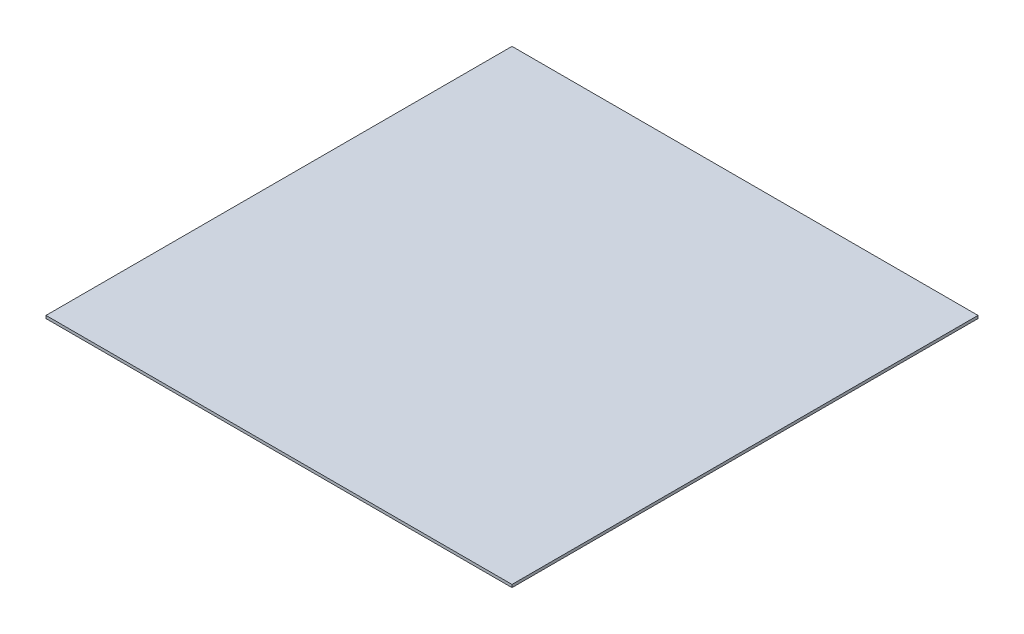
ISO-10303-21;
HEADER;
FILE_DESCRIPTION(('STEP AP214'),'2;1');
FILE_NAME('part.step','',(''),(''),'','','');
FILE_SCHEMA(('AUTOMOTIVE_DESIGN { 1 0 10303 214 1 1 1 1 }'));
ENDSEC;
DATA;
#1=APPLICATION_CONTEXT('core data for automotive mechanical design processes');
#2=APPLICATION_PROTOCOL_DEFINITION('international standard','automotive_design',2000,#1);
#3=PRODUCT_CONTEXT('',#1,'mechanical');
#4=PRODUCT('Part','Part','',(#3));
#5=PRODUCT_RELATED_PRODUCT_CATEGORY('part','',(#4));
#6=PRODUCT_DEFINITION_FORMATION('','',#4);
#7=PRODUCT_DEFINITION_CONTEXT('part definition',#1,'design');
#8=PRODUCT_DEFINITION('design','',#6,#7);
#9=PRODUCT_DEFINITION_SHAPE('','',#8);
#10=(LENGTH_UNIT() NAMED_UNIT(*) SI_UNIT(.MILLI.,.METRE.));
#11=(NAMED_UNIT(*) PLANE_ANGLE_UNIT() SI_UNIT($,.RADIAN.));
#12=(NAMED_UNIT(*) SI_UNIT($,.STERADIAN.) SOLID_ANGLE_UNIT());
#13=UNCERTAINTY_MEASURE_WITH_UNIT(LENGTH_MEASURE(1.E-05),#10,'distance_accuracy_value','');
#14=(GEOMETRIC_REPRESENTATION_CONTEXT(3) GLOBAL_UNCERTAINTY_ASSIGNED_CONTEXT((#13)) GLOBAL_UNIT_ASSIGNED_CONTEXT((#10,
#11,#12)) REPRESENTATION_CONTEXT('',''));
#15=CARTESIAN_POINT('',(0.,0.,0.));
#16=DIRECTION('',(0.,0.,1.));
#17=DIRECTION('',(1.,0.,0.));
#18=AXIS2_PLACEMENT_3D('',#15,#16,#17);
#19=CARTESIAN_POINT('',(12.5,0.15,12.5));
#20=DIRECTION('',(-1.,0.,0.));
#21=DIRECTION('',(0.,0.,1.));
#22=AXIS2_PLACEMENT_3D('',#19,#20,#21);
#23=PLANE('',#22);
#24=DIRECTION('',(0.,0.,-1.));
#25=VECTOR('',#24,1.);
#26=CARTESIAN_POINT('',(12.5,0.,12.5));
#27=LINE('',#26,#25);
#28=CARTESIAN_POINT('',(12.5,0.,12.5));
#29=VERTEX_POINT('',#28);
#30=CARTESIAN_POINT('',(12.5,0.,-12.5));
#31=VERTEX_POINT('',#30);
#32=EDGE_CURVE('E95',#29,#31,#27,.T.);
#33=ORIENTED_EDGE('',*,*,#32,.T.);
#34=DIRECTION('',(0.,-1.,0.));
#35=VECTOR('',#34,1.);
#36=CARTESIAN_POINT('',(12.5,0.15,-12.5));
#37=LINE('',#36,#35);
#38=CARTESIAN_POINT('',(12.5,0.15,-12.5));
#39=VERTEX_POINT('',#38);
#40=EDGE_CURVE('E11',#39,#31,#37,.T.);
#41=ORIENTED_EDGE('',*,*,#40,.F.);
#42=DIRECTION('',(0.,0.,-1.));
#43=VECTOR('',#42,1.);
#44=CARTESIAN_POINT('',(12.5,0.15,12.5));
#45=LINE('',#44,#43);
#46=CARTESIAN_POINT('',(12.5,0.15,12.5));
#47=VERTEX_POINT('',#46);
#48=EDGE_CURVE('E83',#47,#39,#45,.T.);
#49=ORIENTED_EDGE('',*,*,#48,.F.);
#50=DIRECTION('',(0.,-1.,0.));
#51=VECTOR('',#50,1.);
#52=CARTESIAN_POINT('',(12.5,0.15,12.5));
#53=LINE('',#52,#51);
#54=EDGE_CURVE('E91',#47,#29,#53,.T.);
#55=ORIENTED_EDGE('',*,*,#54,.T.);
#56=EDGE_LOOP('',(#33,#41,#49,#55));
#57=FACE_BOUND('',#56,.T.);
#58=ADVANCED_FACE('F32',(#57),#23,.F.);
#59=CARTESIAN_POINT('',(-12.5,0.15,-12.5));
#60=DIRECTION('',(0.,0.,1.));
#61=DIRECTION('',(1.,0.,0.));
#62=AXIS2_PLACEMENT_3D('',#59,#60,#61);
#63=PLANE('',#62);
#64=DIRECTION('',(-1.,0.,0.));
#65=VECTOR('',#64,1.);
#66=CARTESIAN_POINT('',(-12.5,0.,-12.5));
#67=LINE('',#66,#65);
#68=CARTESIAN_POINT('',(-12.5,0.,-12.5));
#69=VERTEX_POINT('',#68);
#70=EDGE_CURVE('E87',#31,#69,#67,.T.);
#71=ORIENTED_EDGE('',*,*,#70,.T.);
#72=DIRECTION('',(0.,-1.,0.));
#73=VECTOR('',#72,1.);
#74=CARTESIAN_POINT('',(-12.5,0.15,-12.5));
#75=LINE('',#74,#73);
#76=CARTESIAN_POINT('',(-12.5,0.15,-12.5));
#77=VERTEX_POINT('',#76);
#78=EDGE_CURVE('E40',#77,#69,#75,.T.);
#79=ORIENTED_EDGE('',*,*,#78,.F.);
#80=DIRECTION('',(-1.,0.,0.));
#81=VECTOR('',#80,1.);
#82=CARTESIAN_POINT('',(-12.5,0.15,-12.5));
#83=LINE('',#82,#81);
#84=EDGE_CURVE('E78',#39,#77,#83,.T.);
#85=ORIENTED_EDGE('',*,*,#84,.F.);
#86=ORIENTED_EDGE('',*,*,#40,.T.);
#87=EDGE_LOOP('',(#71,#79,#85,#86));
#88=FACE_BOUND('',#87,.T.);
#89=ADVANCED_FACE('F86',(#88),#63,.F.);
#90=CARTESIAN_POINT('',(-12.5,0.15,12.5));
#91=DIRECTION('',(1.,0.,0.));
#92=DIRECTION('',(0.,0.,-1.));
#93=AXIS2_PLACEMENT_3D('',#90,#91,#92);
#94=PLANE('',#93);
#95=DIRECTION('',(0.,0.,1.));
#96=VECTOR('',#95,1.);
#97=CARTESIAN_POINT('',(-12.5,0.,12.5));
#98=LINE('',#97,#96);
#99=CARTESIAN_POINT('',(-12.5,0.,12.5));
#100=VERTEX_POINT('',#99);
#101=EDGE_CURVE('E65',#69,#100,#98,.T.);
#102=ORIENTED_EDGE('',*,*,#101,.T.);
#103=DIRECTION('',(0.,-1.,0.));
#104=VECTOR('',#103,1.);
#105=CARTESIAN_POINT('',(-12.5,0.15,12.5));
#106=LINE('',#105,#104);
#107=CARTESIAN_POINT('',(-12.5,0.15,12.5));
#108=VERTEX_POINT('',#107);
#109=EDGE_CURVE('E88',#108,#100,#106,.T.);
#110=ORIENTED_EDGE('',*,*,#109,.F.);
#111=DIRECTION('',(0.,0.,1.));
#112=VECTOR('',#111,1.);
#113=CARTESIAN_POINT('',(-12.5,0.15,12.5));
#114=LINE('',#113,#112);
#115=EDGE_CURVE('E81',#77,#108,#114,.T.);
#116=ORIENTED_EDGE('',*,*,#115,.F.);
#117=ORIENTED_EDGE('',*,*,#78,.T.);
#118=EDGE_LOOP('',(#102,#110,#116,#117));
#119=FACE_BOUND('',#118,.T.);
#120=ADVANCED_FACE('F89',(#119),#94,.F.);
#121=CARTESIAN_POINT('',(-12.5,0.15,12.5));
#122=DIRECTION('',(0.,0.,-1.));
#123=DIRECTION('',(-1.,0.,0.));
#124=AXIS2_PLACEMENT_3D('',#121,#122,#123);
#125=PLANE('',#124);
#126=DIRECTION('',(1.,0.,0.));
#127=VECTOR('',#126,1.);
#128=CARTESIAN_POINT('',(-12.5,0.,12.5));
#129=LINE('',#128,#127);
#130=EDGE_CURVE('E71',#100,#29,#129,.T.);
#131=ORIENTED_EDGE('',*,*,#130,.T.);
#132=ORIENTED_EDGE('',*,*,#54,.F.);
#133=DIRECTION('',(1.,0.,0.));
#134=VECTOR('',#133,1.);
#135=CARTESIAN_POINT('',(-12.5,0.15,12.5));
#136=LINE('',#135,#134);
#137=EDGE_CURVE('E48',#108,#47,#136,.T.);
#138=ORIENTED_EDGE('',*,*,#137,.F.);
#139=ORIENTED_EDGE('',*,*,#109,.T.);
#140=EDGE_LOOP('',(#131,#132,#138,#139));
#141=FACE_BOUND('',#140,.T.);
#142=ADVANCED_FACE('F102',(#141),#125,.F.);
#143=CARTESIAN_POINT('',(0.,0.15,0.));
#144=DIRECTION('',(0.,-1.,0.));
#145=DIRECTION('',(0.,0.,-1.));
#146=AXIS2_PLACEMENT_3D('',#143,#144,#145);
#147=PLANE('',#146);
#148=ORIENTED_EDGE('',*,*,#48,.T.);
#149=ORIENTED_EDGE('',*,*,#84,.T.);
#150=ORIENTED_EDGE('',*,*,#115,.T.);
#151=ORIENTED_EDGE('',*,*,#137,.T.);
#152=EDGE_LOOP('',(#148,#149,#150,#151));
#153=FACE_BOUND('',#152,.T.);
#154=ADVANCED_FACE('F79',(#153),#147,.F.);
#155=CARTESIAN_POINT('',(0.,0.,0.));
#156=DIRECTION('',(0.,-1.,0.));
#157=DIRECTION('',(0.,0.,-1.));
#158=AXIS2_PLACEMENT_3D('',#155,#156,#157);
#159=PLANE('',#158);
#160=ORIENTED_EDGE('',*,*,#32,.F.);
#161=ORIENTED_EDGE('',*,*,#130,.F.);
#162=ORIENTED_EDGE('',*,*,#101,.F.);
#163=ORIENTED_EDGE('',*,*,#70,.F.);
#164=EDGE_LOOP('',(#160,#161,#162,#163));
#165=FACE_BOUND('',#164,.T.);
#166=ADVANCED_FACE('F105',(#165),#159,.T.);
#167=CLOSED_SHELL('',(#58,#89,#120,#142,#154,#166));
#168=MANIFOLD_SOLID_BREP('B2',#167);
#169=ADVANCED_BREP_SHAPE_REPRESENTATION('',(#18,#168),#14);
#170=SHAPE_DEFINITION_REPRESENTATION(#9,#169);
ENDSEC;
END-ISO-10303-21;
